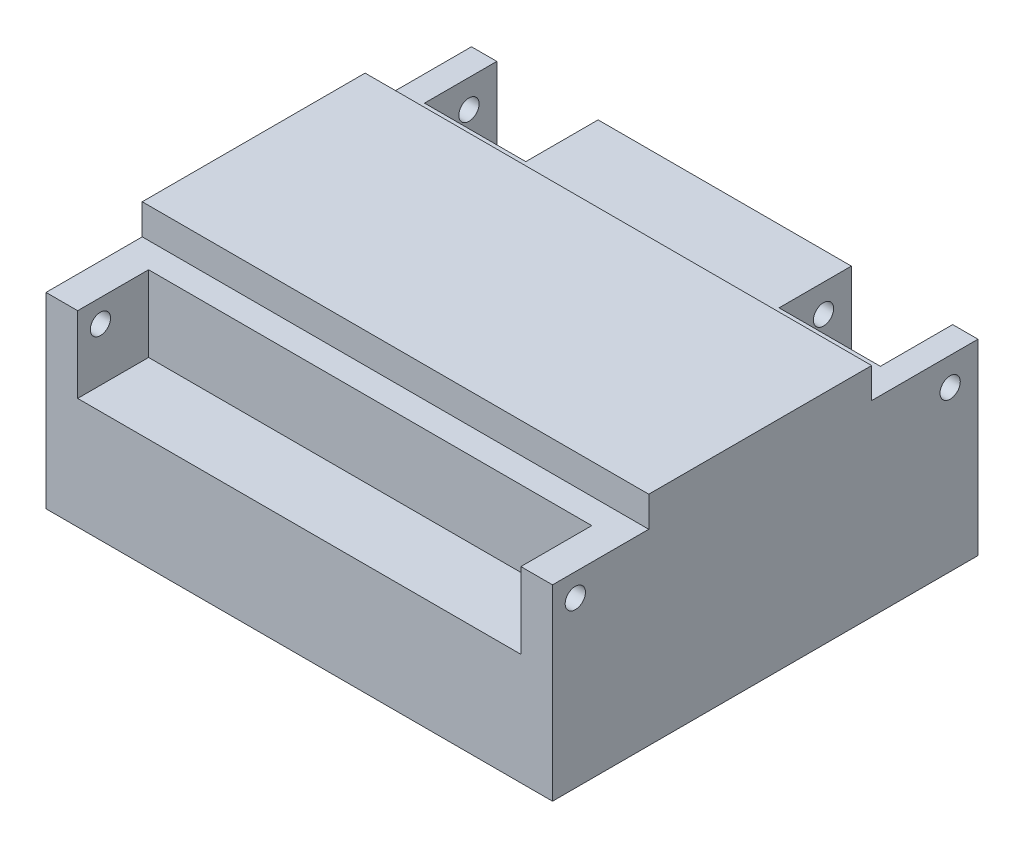
ISO-10303-21;
HEADER;
FILE_DESCRIPTION(('STEP AP214'),'2;1');
FILE_NAME('part.step','',(''),(''),'','','');
FILE_SCHEMA(('AUTOMOTIVE_DESIGN { 1 0 10303 214 1 1 1 1 }'));
ENDSEC;
DATA;
#1=APPLICATION_CONTEXT('core data for automotive mechanical design processes');
#2=APPLICATION_PROTOCOL_DEFINITION('international standard','automotive_design',2000,#1);
#3=PRODUCT_CONTEXT('',#1,'mechanical');
#4=PRODUCT('Part','Part','',(#3));
#5=PRODUCT_RELATED_PRODUCT_CATEGORY('part','',(#4));
#6=PRODUCT_DEFINITION_FORMATION('','',#4);
#7=PRODUCT_DEFINITION_CONTEXT('part definition',#1,'design');
#8=PRODUCT_DEFINITION('design','',#6,#7);
#9=PRODUCT_DEFINITION_SHAPE('','',#8);
#10=(LENGTH_UNIT() NAMED_UNIT(*) SI_UNIT(.MILLI.,.METRE.));
#11=(NAMED_UNIT(*) PLANE_ANGLE_UNIT() SI_UNIT($,.RADIAN.));
#12=(NAMED_UNIT(*) SI_UNIT($,.STERADIAN.) SOLID_ANGLE_UNIT());
#13=UNCERTAINTY_MEASURE_WITH_UNIT(LENGTH_MEASURE(1.E-05),#10,'distance_accuracy_value','');
#14=(GEOMETRIC_REPRESENTATION_CONTEXT(3) GLOBAL_UNCERTAINTY_ASSIGNED_CONTEXT((#13)) GLOBAL_UNIT_ASSIGNED_CONTEXT((#10,
#11,#12)) REPRESENTATION_CONTEXT('',''));
#15=CARTESIAN_POINT('',(0.,0.,0.));
#16=DIRECTION('',(0.,0.,1.));
#17=DIRECTION('',(1.,0.,0.));
#18=AXIS2_PLACEMENT_3D('',#15,#16,#17);
#19=CARTESIAN_POINT('',(-50.00005,0.5,-36.5));
#20=DIRECTION('',(1.,0.,0.));
#21=DIRECTION('',(0.,0.,-1.));
#22=AXIS2_PLACEMENT_3D('',#19,#20,#21);
#23=CYLINDRICAL_SURFACE('',#22,2.);
#24=CARTESIAN_POINT('',(45.,0.5,-36.5));
#25=DIRECTION('',(1.,0.,0.));
#26=DIRECTION('',(0.,0.,-1.));
#27=AXIS2_PLACEMENT_3D('',#24,#25,#26);
#28=CIRCLE('',#27,2.);
#29=CARTESIAN_POINT('',(45.,0.5,-38.5));
#30=VERTEX_POINT('',#29);
#31=EDGE_CURVE('E37',#30,#30,#28,.F.);
#32=ORIENTED_EDGE('',*,*,#31,.T.);
#33=EDGE_LOOP('',(#32));
#34=FACE_BOUND('',#33,.T.);
#35=CARTESIAN_POINT('',(50.,0.5,-36.5));
#36=DIRECTION('',(1.,0.,0.));
#37=DIRECTION('',(0.,0.,-1.));
#38=AXIS2_PLACEMENT_3D('',#35,#36,#37);
#39=CIRCLE('',#38,2.);
#40=CARTESIAN_POINT('',(50.,0.5,-38.5));
#41=VERTEX_POINT('',#40);
#42=EDGE_CURVE('E266',#41,#41,#39,.T.);
#43=ORIENTED_EDGE('',*,*,#42,.T.);
#44=EDGE_LOOP('',(#43));
#45=FACE_BOUND('',#44,.T.);
#46=ADVANCED_FACE('F33',(#34,#45),#23,.F.);
#47=CARTESIAN_POINT('',(-45.,0.5,-36.5));
#48=DIRECTION('',(-1.,0.,0.));
#49=DIRECTION('',(0.,0.,1.));
#50=AXIS2_PLACEMENT_3D('',#47,#48,#49);
#51=CIRCLE('',#50,2.);
#52=CARTESIAN_POINT('',(-45.,0.5,-34.5));
#53=VERTEX_POINT('',#52);
#54=EDGE_CURVE('E270',#53,#53,#51,.F.);
#55=ORIENTED_EDGE('',*,*,#54,.T.);
#56=EDGE_LOOP('',(#55));
#57=FACE_BOUND('',#56,.T.);
#58=CARTESIAN_POINT('',(-50.,0.5,-36.5));
#59=DIRECTION('',(1.,0.,0.));
#60=DIRECTION('',(0.,0.,-1.));
#61=AXIS2_PLACEMENT_3D('',#58,#59,#60);
#62=CIRCLE('',#61,2.);
#63=CARTESIAN_POINT('',(-50.,0.5,-38.5));
#64=VERTEX_POINT('',#63);
#65=EDGE_CURVE('E279',#64,#64,#62,.T.);
#66=ORIENTED_EDGE('',*,*,#65,.F.);
#67=EDGE_LOOP('',(#66));
#68=FACE_BOUND('',#67,.T.);
#69=ADVANCED_FACE('F515',(#57,#68),#23,.F.);
#70=CARTESIAN_POINT('',(15.,0.,-12.));
#71=DIRECTION('',(0.,1.,0.));
#72=DIRECTION('',(0.,0.,1.));
#73=AXIS2_PLACEMENT_3D('',#70,#71,#72);
#74=PLANE('',#73);
#75=DIRECTION('',(0.,0.,-1.));
#76=VECTOR('',#75,1.);
#77=CARTESIAN_POINT('',(-15.,0.,-12.));
#78=LINE('',#77,#76);
#79=CARTESIAN_POINT('',(-15.,0.,-12.));
#80=VERTEX_POINT('',#79);
#81=CARTESIAN_POINT('',(-15.,0.,-34.5635083268963));
#82=VERTEX_POINT('',#81);
#83=EDGE_CURVE('E344',#80,#82,#78,.T.);
#84=ORIENTED_EDGE('',*,*,#83,.T.);
#85=DIRECTION('',(1.,0.,0.));
#86=VECTOR('',#85,1.);
#87=CARTESIAN_POINT('',(-50.00005,0.,-34.5635083268963));
#88=LINE('',#87,#86);
#89=CARTESIAN_POINT('',(15.,0.,-34.5635083268963));
#90=VERTEX_POINT('',#89);
#91=EDGE_CURVE('E273',#82,#90,#88,.T.);
#92=ORIENTED_EDGE('',*,*,#91,.T.);
#93=DIRECTION('',(0.,0.,-1.));
#94=VECTOR('',#93,1.);
#95=CARTESIAN_POINT('',(15.,0.,-12.));
#96=LINE('',#95,#94);
#97=CARTESIAN_POINT('',(15.,0.,-12.));
#98=VERTEX_POINT('',#97);
#99=EDGE_CURVE('E339',#98,#90,#96,.T.);
#100=ORIENTED_EDGE('',*,*,#99,.F.);
#101=DIRECTION('',(1.,0.,0.));
#102=VECTOR('',#101,1.);
#103=CARTESIAN_POINT('',(15.,0.,-12.));
#104=LINE('',#103,#102);
#105=EDGE_CURVE('E326',#80,#98,#104,.T.);
#106=ORIENTED_EDGE('',*,*,#105,.F.);
#107=EDGE_LOOP('',(#84,#92,#100,#106));
#108=FACE_BOUND('',#107,.T.);
#109=ADVANCED_FACE('F523',(#108),#74,.F.);
#110=CARTESIAN_POINT('',(50.00005,1.5,37.5));
#111=DIRECTION('',(-1.,0.,0.));
#112=DIRECTION('',(0.,0.,1.));
#113=AXIS2_PLACEMENT_3D('',#110,#111,#112);
#114=CYLINDRICAL_SURFACE('',#113,2.);
#115=CARTESIAN_POINT('',(43.75,1.5,37.5));
#116=DIRECTION('',(1.,0.,0.));
#117=DIRECTION('',(0.,0.,-1.));
#118=AXIS2_PLACEMENT_3D('',#115,#116,#117);
#119=CIRCLE('',#118,2.);
#120=CARTESIAN_POINT('',(43.75,1.5,35.5));
#121=VERTEX_POINT('',#120);
#122=EDGE_CURVE('E305',#121,#121,#119,.F.);
#123=ORIENTED_EDGE('',*,*,#122,.T.);
#124=EDGE_LOOP('',(#123));
#125=FACE_BOUND('',#124,.T.);
#126=CARTESIAN_POINT('',(50.,1.5,37.5));
#127=DIRECTION('',(-1.,0.,0.));
#128=DIRECTION('',(0.,0.,1.));
#129=AXIS2_PLACEMENT_3D('',#126,#127,#128);
#130=CIRCLE('',#129,2.);
#131=CARTESIAN_POINT('',(50.,1.5,39.5));
#132=VERTEX_POINT('',#131);
#133=EDGE_CURVE('E312',#132,#132,#130,.T.);
#134=ORIENTED_EDGE('',*,*,#133,.F.);
#135=EDGE_LOOP('',(#134));
#136=FACE_BOUND('',#135,.T.);
#137=ADVANCED_FACE('F619',(#125,#136),#114,.F.);
#138=CARTESIAN_POINT('',(0.,6.,0.));
#139=DIRECTION('',(0.,1.,0.));
#140=DIRECTION('',(0.,0.,1.));
#141=AXIS2_PLACEMENT_3D('',#138,#139,#140);
#142=PLANE('',#141);
#143=DIRECTION('',(0.,0.,-1.));
#144=VECTOR('',#143,1.);
#145=CARTESIAN_POINT('',(43.75,6.,54.));
#146=LINE('',#145,#144);
#147=CARTESIAN_POINT('',(43.75,6.,42.));
#148=VERTEX_POINT('',#147);
#149=CARTESIAN_POINT('',(43.75,6.,28.));
#150=VERTEX_POINT('',#149);
#151=EDGE_CURVE('E282',#148,#150,#146,.T.);
#152=ORIENTED_EDGE('',*,*,#151,.F.);
#153=DIRECTION('',(1.,0.,0.));
#154=VECTOR('',#153,1.);
#155=CARTESIAN_POINT('',(-50.,6.,42.));
#156=LINE('',#155,#154);
#157=CARTESIAN_POINT('',(50.,6.,42.));
#158=VERTEX_POINT('',#157);
#159=EDGE_CURVE('E459',#148,#158,#156,.T.);
#160=ORIENTED_EDGE('',*,*,#159,.T.);
#161=DIRECTION('',(0.,0.,-1.));
#162=VECTOR('',#161,1.);
#163=CARTESIAN_POINT('',(50.,6.,-42.));
#164=LINE('',#163,#162);
#165=CARTESIAN_POINT('',(50.,6.,22.9999999999999));
#166=VERTEX_POINT('',#165);
#167=EDGE_CURVE('E448',#158,#166,#164,.T.);
#168=ORIENTED_EDGE('',*,*,#167,.T.);
#169=DIRECTION('',(1.,0.,0.));
#170=VECTOR('',#169,1.);
#171=CARTESIAN_POINT('',(-50.,6.,23.));
#172=LINE('',#171,#170);
#173=CARTESIAN_POINT('',(-50.,6.,22.9999999999999));
#174=VERTEX_POINT('',#173);
#175=EDGE_CURVE('E368',#174,#166,#172,.T.);
#176=ORIENTED_EDGE('',*,*,#175,.F.);
#177=DIRECTION('',(0.,0.,1.));
#178=VECTOR('',#177,1.);
#179=CARTESIAN_POINT('',(-50.,6.,-42.));
#180=LINE('',#179,#178);
#181=CARTESIAN_POINT('',(-50.,6.,42.));
#182=VERTEX_POINT('',#181);
#183=EDGE_CURVE('E383',#174,#182,#180,.T.);
#184=ORIENTED_EDGE('',*,*,#183,.T.);
#185=CARTESIAN_POINT('',(-43.75,6.,42.));
#186=VERTEX_POINT('',#185);
#187=EDGE_CURVE('E462',#182,#186,#156,.T.);
#188=ORIENTED_EDGE('',*,*,#187,.T.);
#189=DIRECTION('',(0.,0.,1.));
#190=VECTOR('',#189,1.);
#191=CARTESIAN_POINT('',(-43.75,6.,54.));
#192=LINE('',#191,#190);
#193=CARTESIAN_POINT('',(-43.75,6.,28.));
#194=VERTEX_POINT('',#193);
#195=EDGE_CURVE('E286',#194,#186,#192,.T.);
#196=ORIENTED_EDGE('',*,*,#195,.F.);
#197=DIRECTION('',(-1.,0.,0.));
#198=VECTOR('',#197,1.);
#199=CARTESIAN_POINT('',(-43.75,6.,28.));
#200=LINE('',#199,#198);
#201=EDGE_CURVE('E293',#150,#194,#200,.T.);
#202=ORIENTED_EDGE('',*,*,#201,.F.);
#203=EDGE_LOOP('',(#152,#160,#168,#176,#184,#188,#196,#202));
#204=FACE_BOUND('',#203,.T.);
#205=ADVANCED_FACE('F491',(#204),#142,.T.);
#206=CARTESIAN_POINT('',(50.,6.,-42.));
#207=DIRECTION('',(-1.,0.,0.));
#208=DIRECTION('',(0.,0.,1.));
#209=AXIS2_PLACEMENT_3D('',#206,#207,#208);
#210=PLANE('',#209);
#211=ORIENTED_EDGE('',*,*,#42,.F.);
#212=EDGE_LOOP('',(#211));
#213=FACE_BOUND('',#212,.T.);
#214=ORIENTED_EDGE('',*,*,#133,.T.);
#215=EDGE_LOOP('',(#214));
#216=FACE_BOUND('',#215,.T.);
#217=DIRECTION('',(0.,-1.,0.));
#218=VECTOR('',#217,1.);
#219=CARTESIAN_POINT('',(50.,6.,42.));
#220=LINE('',#219,#218);
#221=CARTESIAN_POINT('',(50.,-31.,42.));
#222=VERTEX_POINT('',#221);
#223=EDGE_CURVE('E466',#158,#222,#220,.T.);
#224=ORIENTED_EDGE('',*,*,#223,.T.);
#225=DIRECTION('',(0.,0.,1.));
#226=VECTOR('',#225,1.);
#227=CARTESIAN_POINT('',(50.,-31.,42.));
#228=LINE('',#227,#226);
#229=CARTESIAN_POINT('',(50.,-31.,-42.));
#230=VERTEX_POINT('',#229);
#231=EDGE_CURVE('E357',#230,#222,#228,.T.);
#232=ORIENTED_EDGE('',*,*,#231,.F.);
#233=DIRECTION('',(0.,-1.,0.));
#234=VECTOR('',#233,1.);
#235=CARTESIAN_POINT('',(50.,6.,-42.));
#236=LINE('',#235,#234);
#237=CARTESIAN_POINT('',(50.,6.,-42.));
#238=VERTEX_POINT('',#237);
#239=EDGE_CURVE('E413',#238,#230,#236,.T.);
#240=ORIENTED_EDGE('',*,*,#239,.F.);
#241=CARTESIAN_POINT('',(50.,6.,-21.));
#242=VERTEX_POINT('',#241);
#243=EDGE_CURVE('E395',#242,#238,#164,.T.);
#244=ORIENTED_EDGE('',*,*,#243,.F.);
#245=DIRECTION('',(0.,-1.,0.));
#246=VECTOR('',#245,1.);
#247=CARTESIAN_POINT('',(50.,12.,-21.));
#248=LINE('',#247,#246);
#249=CARTESIAN_POINT('',(50.,12.,-21.));
#250=VERTEX_POINT('',#249);
#251=EDGE_CURVE('E389',#250,#242,#248,.T.);
#252=ORIENTED_EDGE('',*,*,#251,.F.);
#253=DIRECTION('',(0.,0.,-1.));
#254=VECTOR('',#253,1.);
#255=CARTESIAN_POINT('',(50.,12.,-21.));
#256=LINE('',#255,#254);
#257=CARTESIAN_POINT('',(50.,12.,23.));
#258=VERTEX_POINT('',#257);
#259=EDGE_CURVE('E364',#258,#250,#256,.T.);
#260=ORIENTED_EDGE('',*,*,#259,.F.);
#261=DIRECTION('',(0.,-1.,0.));
#262=VECTOR('',#261,1.);
#263=CARTESIAN_POINT('',(50.,12.,23.));
#264=LINE('',#263,#262);
#265=EDGE_CURVE('E374',#258,#166,#264,.T.);
#266=ORIENTED_EDGE('',*,*,#265,.T.);
#267=ORIENTED_EDGE('',*,*,#167,.F.);
#268=EDGE_LOOP('',(#224,#232,#240,#244,#252,#260,#266,#267));
#269=FACE_BOUND('',#268,.T.);
#270=ADVANCED_FACE('F35',(#213,#216,#269),#210,.F.);
#271=CARTESIAN_POINT('',(-50.,6.,-42.));
#272=DIRECTION('',(0.,0.,1.));
#273=DIRECTION('',(1.,0.,0.));
#274=AXIS2_PLACEMENT_3D('',#271,#272,#273);
#275=PLANE('',#274);
#276=DIRECTION('',(-1.,0.,0.));
#277=VECTOR('',#276,1.);
#278=CARTESIAN_POINT('',(45.,-9.,-42.));
#279=LINE('',#278,#277);
#280=CARTESIAN_POINT('',(45.,-9.,-42.));
#281=VERTEX_POINT('',#280);
#282=CARTESIAN_POINT('',(25.,-9.,-42.));
#283=VERTEX_POINT('',#282);
#284=EDGE_CURVE('E216',#281,#283,#279,.T.);
#285=ORIENTED_EDGE('',*,*,#284,.F.);
#286=DIRECTION('',(0.,1.,0.));
#287=VECTOR('',#286,1.);
#288=CARTESIAN_POINT('',(45.,-9.,-42.));
#289=LINE('',#288,#287);
#290=CARTESIAN_POINT('',(45.,6.,-42.));
#291=VERTEX_POINT('',#290);
#292=EDGE_CURVE('E420',#281,#291,#289,.T.);
#293=ORIENTED_EDGE('',*,*,#292,.T.);
#294=DIRECTION('',(-1.,0.,0.));
#295=VECTOR('',#294,1.);
#296=CARTESIAN_POINT('',(-50.,6.,-42.));
#297=LINE('',#296,#295);
#298=EDGE_CURVE('E442',#238,#291,#297,.T.);
#299=ORIENTED_EDGE('',*,*,#298,.F.);
#300=ORIENTED_EDGE('',*,*,#239,.T.);
#301=DIRECTION('',(1.,0.,0.));
#302=VECTOR('',#301,1.);
#303=CARTESIAN_POINT('',(-50.,-31.,-42.));
#304=LINE('',#303,#302);
#305=CARTESIAN_POINT('',(-50.,-31.,-42.));
#306=VERTEX_POINT('',#305);
#307=EDGE_CURVE('E354',#306,#230,#304,.T.);
#308=ORIENTED_EDGE('',*,*,#307,.F.);
#309=DIRECTION('',(0.,-1.,0.));
#310=VECTOR('',#309,1.);
#311=CARTESIAN_POINT('',(-50.,6.,-42.));
#312=LINE('',#311,#310);
#313=CARTESIAN_POINT('',(-50.,6.,-42.));
#314=VERTEX_POINT('',#313);
#315=EDGE_CURVE('E469',#314,#306,#312,.T.);
#316=ORIENTED_EDGE('',*,*,#315,.F.);
#317=CARTESIAN_POINT('',(-45.,6.,-42.));
#318=VERTEX_POINT('',#317);
#319=EDGE_CURVE('E446',#318,#314,#297,.T.);
#320=ORIENTED_EDGE('',*,*,#319,.F.);
#321=DIRECTION('',(0.,1.,0.));
#322=VECTOR('',#321,1.);
#323=CARTESIAN_POINT('',(-45.,-9.,-42.));
#324=LINE('',#323,#322);
#325=CARTESIAN_POINT('',(-45.,-9.,-42.));
#326=VERTEX_POINT('',#325);
#327=EDGE_CURVE('E258',#326,#318,#324,.T.);
#328=ORIENTED_EDGE('',*,*,#327,.F.);
#329=DIRECTION('',(-1.,0.,0.));
#330=VECTOR('',#329,1.);
#331=CARTESIAN_POINT('',(-45.,-9.,-42.));
#332=LINE('',#331,#330);
#333=CARTESIAN_POINT('',(-25.,-9.,-42.));
#334=VERTEX_POINT('',#333);
#335=EDGE_CURVE('E248',#334,#326,#332,.T.);
#336=ORIENTED_EDGE('',*,*,#335,.F.);
#337=DIRECTION('',(0.,1.,0.));
#338=VECTOR('',#337,1.);
#339=CARTESIAN_POINT('',(-25.,-9.,-42.));
#340=LINE('',#339,#338);
#341=CARTESIAN_POINT('',(-25.,6.,-42.));
#342=VERTEX_POINT('',#341);
#343=EDGE_CURVE('E261',#334,#342,#340,.T.);
#344=ORIENTED_EDGE('',*,*,#343,.T.);
#345=CARTESIAN_POINT('',(25.,6.,-42.));
#346=VERTEX_POINT('',#345);
#347=EDGE_CURVE('E231',#346,#342,#297,.T.);
#348=ORIENTED_EDGE('',*,*,#347,.F.);
#349=DIRECTION('',(0.,1.,0.));
#350=VECTOR('',#349,1.);
#351=CARTESIAN_POINT('',(25.,-9.,-42.));
#352=LINE('',#351,#350);
#353=EDGE_CURVE('E50',#283,#346,#352,.T.);
#354=ORIENTED_EDGE('',*,*,#353,.F.);
#355=EDGE_LOOP('',(#285,#293,#299,#300,#308,#316,#320,#328,#336,#344,#348,#354));
#356=FACE_BOUND('',#355,.T.);
#357=DIRECTION('',(-1.,0.,0.));
#358=VECTOR('',#357,1.);
#359=CARTESIAN_POINT('',(15.,-5.69935721066687,-42.));
#360=LINE('',#359,#358);
#361=CARTESIAN_POINT('',(15.,-5.69935721066687,-42.));
#362=VERTEX_POINT('',#361);
#363=CARTESIAN_POINT('',(-15.,-5.69935721066687,-42.));
#364=VERTEX_POINT('',#363);
#365=EDGE_CURVE('E331',#362,#364,#360,.T.);
#366=ORIENTED_EDGE('',*,*,#365,.F.);
#367=DIRECTION('',(0.,-1.,0.));
#368=VECTOR('',#367,1.);
#369=CARTESIAN_POINT('',(15.,0.,-42.));
#370=LINE('',#369,#368);
#371=CARTESIAN_POINT('',(15.,0.,-42.));
#372=VERTEX_POINT('',#371);
#373=EDGE_CURVE('E315',#372,#362,#370,.T.);
#374=ORIENTED_EDGE('',*,*,#373,.F.);
#375=DIRECTION('',(1.,0.,0.));
#376=VECTOR('',#375,1.);
#377=CARTESIAN_POINT('',(15.,0.,-42.));
#378=LINE('',#377,#376);
#379=CARTESIAN_POINT('',(-15.,0.,-42.));
#380=VERTEX_POINT('',#379);
#381=EDGE_CURVE('E320',#380,#372,#378,.T.);
#382=ORIENTED_EDGE('',*,*,#381,.F.);
#383=DIRECTION('',(0.,1.,0.));
#384=VECTOR('',#383,1.);
#385=CARTESIAN_POINT('',(-15.,0.,-42.));
#386=LINE('',#385,#384);
#387=EDGE_CURVE('E334',#364,#380,#386,.T.);
#388=ORIENTED_EDGE('',*,*,#387,.F.);
#389=EDGE_LOOP('',(#366,#374,#382,#388));
#390=FACE_BOUND('',#389,.T.);
#391=ADVANCED_FACE('F228',(#356,#390),#275,.F.);
#392=CARTESIAN_POINT('',(-50.,6.,-42.));
#393=DIRECTION('',(1.,0.,0.));
#394=DIRECTION('',(0.,0.,-1.));
#395=AXIS2_PLACEMENT_3D('',#392,#393,#394);
#396=PLANE('',#395);
#397=ORIENTED_EDGE('',*,*,#65,.T.);
#398=EDGE_LOOP('',(#397));
#399=FACE_BOUND('',#398,.T.);
#400=CARTESIAN_POINT('',(-50.,1.5,37.5));
#401=DIRECTION('',(-1.,0.,0.));
#402=DIRECTION('',(0.,0.,1.));
#403=AXIS2_PLACEMENT_3D('',#400,#401,#402);
#404=CIRCLE('',#403,2.);
#405=CARTESIAN_POINT('',(-50.,1.5,39.5));
#406=VERTEX_POINT('',#405);
#407=EDGE_CURVE('E309',#406,#406,#404,.T.);
#408=ORIENTED_EDGE('',*,*,#407,.F.);
#409=EDGE_LOOP('',(#408));
#410=FACE_BOUND('',#409,.T.);
#411=ORIENTED_EDGE('',*,*,#315,.T.);
#412=DIRECTION('',(0.,0.,-1.));
#413=VECTOR('',#412,1.);
#414=CARTESIAN_POINT('',(-50.,-31.,42.));
#415=LINE('',#414,#413);
#416=CARTESIAN_POINT('',(-50.,-31.,42.));
#417=VERTEX_POINT('',#416);
#418=EDGE_CURVE('E342',#417,#306,#415,.T.);
#419=ORIENTED_EDGE('',*,*,#418,.F.);
#420=DIRECTION('',(0.,-1.,0.));
#421=VECTOR('',#420,1.);
#422=CARTESIAN_POINT('',(-50.,6.,42.));
#423=LINE('',#422,#421);
#424=EDGE_CURVE('E468',#182,#417,#423,.T.);
#425=ORIENTED_EDGE('',*,*,#424,.F.);
#426=ORIENTED_EDGE('',*,*,#183,.F.);
#427=DIRECTION('',(0.,-1.,0.));
#428=VECTOR('',#427,1.);
#429=CARTESIAN_POINT('',(-50.,12.,23.));
#430=LINE('',#429,#428);
#431=CARTESIAN_POINT('',(-50.,12.,23.));
#432=VERTEX_POINT('',#431);
#433=EDGE_CURVE('E390',#432,#174,#430,.T.);
#434=ORIENTED_EDGE('',*,*,#433,.F.);
#435=DIRECTION('',(0.,0.,1.));
#436=VECTOR('',#435,1.);
#437=CARTESIAN_POINT('',(-50.,12.,-21.));
#438=LINE('',#437,#436);
#439=CARTESIAN_POINT('',(-50.,12.,-21.));
#440=VERTEX_POINT('',#439);
#441=EDGE_CURVE('E370',#440,#432,#438,.T.);
#442=ORIENTED_EDGE('',*,*,#441,.F.);
#443=DIRECTION('',(0.,-1.,0.));
#444=VECTOR('',#443,1.);
#445=CARTESIAN_POINT('',(-50.,12.,-21.));
#446=LINE('',#445,#444);
#447=CARTESIAN_POINT('',(-50.,6.,-21.));
#448=VERTEX_POINT('',#447);
#449=EDGE_CURVE('E386',#440,#448,#446,.T.);
#450=ORIENTED_EDGE('',*,*,#449,.T.);
#451=EDGE_CURVE('E447',#314,#448,#180,.T.);
#452=ORIENTED_EDGE('',*,*,#451,.F.);
#453=EDGE_LOOP('',(#411,#419,#425,#426,#434,#442,#450,#452));
#454=FACE_BOUND('',#453,.T.);
#455=ADVANCED_FACE('F485',(#399,#410,#454),#396,.F.);
#456=CARTESIAN_POINT('',(-50.,6.,42.));
#457=DIRECTION('',(0.,0.,-1.));
#458=DIRECTION('',(-1.,0.,0.));
#459=AXIS2_PLACEMENT_3D('',#456,#457,#458);
#460=PLANE('',#459);
#461=ORIENTED_EDGE('',*,*,#159,.F.);
#462=DIRECTION('',(0.,-1.,0.));
#463=VECTOR('',#462,1.);
#464=CARTESIAN_POINT('',(43.75,6.,42.));
#465=LINE('',#464,#463);
#466=CARTESIAN_POINT('',(43.75,-9.,42.));
#467=VERTEX_POINT('',#466);
#468=EDGE_CURVE('E306',#148,#467,#465,.T.);
#469=ORIENTED_EDGE('',*,*,#468,.T.);
#470=DIRECTION('',(-1.,0.,0.));
#471=VECTOR('',#470,1.);
#472=CARTESIAN_POINT('',(-50.,-9.,42.));
#473=LINE('',#472,#471);
#474=CARTESIAN_POINT('',(-43.75,-9.,42.));
#475=VERTEX_POINT('',#474);
#476=EDGE_CURVE('E42',#467,#475,#473,.T.);
#477=ORIENTED_EDGE('',*,*,#476,.T.);
#478=DIRECTION('',(0.,1.,0.));
#479=VECTOR('',#478,1.);
#480=CARTESIAN_POINT('',(-43.75,6.,42.));
#481=LINE('',#480,#479);
#482=EDGE_CURVE('E302',#475,#186,#481,.T.);
#483=ORIENTED_EDGE('',*,*,#482,.T.);
#484=ORIENTED_EDGE('',*,*,#187,.F.);
#485=ORIENTED_EDGE('',*,*,#424,.T.);
#486=DIRECTION('',(-1.,0.,0.));
#487=VECTOR('',#486,1.);
#488=CARTESIAN_POINT('',(-50.,-31.,42.));
#489=LINE('',#488,#487);
#490=EDGE_CURVE('E360',#222,#417,#489,.T.);
#491=ORIENTED_EDGE('',*,*,#490,.F.);
#492=ORIENTED_EDGE('',*,*,#223,.F.);
#493=EDGE_LOOP('',(#461,#469,#477,#483,#484,#485,#491,#492));
#494=FACE_BOUND('',#493,.T.);
#495=ADVANCED_FACE('F482',(#494),#460,.F.);
#496=DIRECTION('',(0.,0.,-1.));
#497=VECTOR('',#496,1.);
#498=CARTESIAN_POINT('',(45.,6.,-42.));
#499=LINE('',#498,#497);
#500=CARTESIAN_POINT('',(45.,6.,-27.7230108647227));
#501=VERTEX_POINT('',#500);
#502=EDGE_CURVE('E225',#501,#291,#499,.T.);
#503=ORIENTED_EDGE('',*,*,#502,.F.);
#504=DIRECTION('',(1.,0.,0.));
#505=VECTOR('',#504,1.);
#506=CARTESIAN_POINT('',(45.,6.,-27.7230108647227));
#507=LINE('',#506,#505);
#508=CARTESIAN_POINT('',(25.,6.,-27.7230108647227));
#509=VERTEX_POINT('',#508);
#510=EDGE_CURVE('E429',#509,#501,#507,.T.);
#511=ORIENTED_EDGE('',*,*,#510,.F.);
#512=DIRECTION('',(0.,0.,1.));
#513=VECTOR('',#512,1.);
#514=CARTESIAN_POINT('',(25.,6.,-42.));
#515=LINE('',#514,#513);
#516=EDGE_CURVE('E432',#346,#509,#515,.T.);
#517=ORIENTED_EDGE('',*,*,#516,.F.);
#518=ORIENTED_EDGE('',*,*,#347,.T.);
#519=DIRECTION('',(0.,0.,-1.));
#520=VECTOR('',#519,1.);
#521=CARTESIAN_POINT('',(-25.,6.,-42.));
#522=LINE('',#521,#520);
#523=CARTESIAN_POINT('',(-25.,6.,-27.7230108647227));
#524=VERTEX_POINT('',#523);
#525=EDGE_CURVE('E242',#524,#342,#522,.T.);
#526=ORIENTED_EDGE('',*,*,#525,.F.);
#527=DIRECTION('',(1.,0.,0.));
#528=VECTOR('',#527,1.);
#529=CARTESIAN_POINT('',(-45.,6.,-27.7230108647227));
#530=LINE('',#529,#528);
#531=CARTESIAN_POINT('',(-45.,6.,-27.7230108647227));
#532=VERTEX_POINT('',#531);
#533=EDGE_CURVE('E253',#532,#524,#530,.T.);
#534=ORIENTED_EDGE('',*,*,#533,.F.);
#535=DIRECTION('',(0.,0.,1.));
#536=VECTOR('',#535,1.);
#537=CARTESIAN_POINT('',(-45.,6.,-42.));
#538=LINE('',#537,#536);
#539=EDGE_CURVE('E58',#318,#532,#538,.T.);
#540=ORIENTED_EDGE('',*,*,#539,.F.);
#541=ORIENTED_EDGE('',*,*,#319,.T.);
#542=ORIENTED_EDGE('',*,*,#451,.T.);
#543=DIRECTION('',(-1.,0.,0.));
#544=VECTOR('',#543,1.);
#545=CARTESIAN_POINT('',(-50.,6.,-21.));
#546=LINE('',#545,#544);
#547=EDGE_CURVE('E363',#242,#448,#546,.T.);
#548=ORIENTED_EDGE('',*,*,#547,.F.);
#549=ORIENTED_EDGE('',*,*,#243,.T.);
#550=ORIENTED_EDGE('',*,*,#298,.T.);
#551=EDGE_LOOP('',(#503,#511,#517,#518,#526,#534,#540,#541,#542,#548,#549,#550));
#552=FACE_BOUND('',#551,.T.);
#553=ADVANCED_FACE('F441',(#552),#142,.T.);
#554=CARTESIAN_POINT('',(-50.,12.,-21.));
#555=DIRECTION('',(0.,0.,1.));
#556=DIRECTION('',(1.,0.,0.));
#557=AXIS2_PLACEMENT_3D('',#554,#555,#556);
#558=PLANE('',#557);
#559=ORIENTED_EDGE('',*,*,#547,.T.);
#560=ORIENTED_EDGE('',*,*,#449,.F.);
#561=DIRECTION('',(-1.,0.,0.));
#562=VECTOR('',#561,1.);
#563=CARTESIAN_POINT('',(-50.,12.,-21.));
#564=LINE('',#563,#562);
#565=EDGE_CURVE('E367',#250,#440,#564,.T.);
#566=ORIENTED_EDGE('',*,*,#565,.F.);
#567=ORIENTED_EDGE('',*,*,#251,.T.);
#568=EDGE_LOOP('',(#559,#560,#566,#567));
#569=FACE_BOUND('',#568,.T.);
#570=ADVANCED_FACE('F504',(#569),#558,.F.);
#571=CARTESIAN_POINT('',(-50.,12.,23.));
#572=DIRECTION('',(0.,0.,-1.));
#573=DIRECTION('',(-1.,0.,0.));
#574=AXIS2_PLACEMENT_3D('',#571,#572,#573);
#575=PLANE('',#574);
#576=ORIENTED_EDGE('',*,*,#175,.T.);
#577=ORIENTED_EDGE('',*,*,#265,.F.);
#578=DIRECTION('',(1.,0.,0.));
#579=VECTOR('',#578,1.);
#580=CARTESIAN_POINT('',(-50.,12.,23.));
#581=LINE('',#580,#579);
#582=EDGE_CURVE('E372',#432,#258,#581,.T.);
#583=ORIENTED_EDGE('',*,*,#582,.F.);
#584=ORIENTED_EDGE('',*,*,#433,.T.);
#585=EDGE_LOOP('',(#576,#577,#583,#584));
#586=FACE_BOUND('',#585,.T.);
#587=ADVANCED_FACE('F495',(#586),#575,.F.);
#588=CARTESIAN_POINT('',(0.,12.,0.));
#589=DIRECTION('',(0.,1.,0.));
#590=DIRECTION('',(0.,0.,1.));
#591=AXIS2_PLACEMENT_3D('',#588,#589,#590);
#592=PLANE('',#591);
#593=ORIENTED_EDGE('',*,*,#259,.T.);
#594=ORIENTED_EDGE('',*,*,#565,.T.);
#595=ORIENTED_EDGE('',*,*,#441,.T.);
#596=ORIENTED_EDGE('',*,*,#582,.T.);
#597=EDGE_LOOP('',(#593,#594,#595,#596));
#598=FACE_BOUND('',#597,.T.);
#599=ADVANCED_FACE('F500',(#598),#592,.T.);
#600=CARTESIAN_POINT('',(0.,-31.,0.));
#601=DIRECTION('',(0.,-1.,0.));
#602=DIRECTION('',(0.,0.,-1.));
#603=AXIS2_PLACEMENT_3D('',#600,#601,#602);
#604=PLANE('',#603);
#605=ORIENTED_EDGE('',*,*,#418,.T.);
#606=ORIENTED_EDGE('',*,*,#307,.T.);
#607=ORIENTED_EDGE('',*,*,#231,.T.);
#608=ORIENTED_EDGE('',*,*,#490,.T.);
#609=EDGE_LOOP('',(#605,#606,#607,#608));
#610=FACE_BOUND('',#609,.T.);
#611=ADVANCED_FACE('F477',(#610),#604,.T.);
#612=CARTESIAN_POINT('',(15.,0.,-12.));
#613=DIRECTION('',(1.,0.,0.));
#614=DIRECTION('',(0.,0.,-1.));
#615=AXIS2_PLACEMENT_3D('',#612,#613,#614);
#616=PLANE('',#615);
#617=ORIENTED_EDGE('',*,*,#99,.T.);
#618=CARTESIAN_POINT('',(15.,0.5,-36.5));
#619=DIRECTION('',(1.,0.,0.));
#620=DIRECTION('',(0.,0.,-1.));
#621=AXIS2_PLACEMENT_3D('',#618,#619,#620);
#622=CIRCLE('',#621,2.);
#623=CARTESIAN_POINT('',(15.,0.,-38.4364916731037));
#624=VERTEX_POINT('',#623);
#625=EDGE_CURVE('E276',#90,#624,#622,.T.);
#626=ORIENTED_EDGE('',*,*,#625,.T.);
#627=EDGE_CURVE('E343',#624,#372,#96,.T.);
#628=ORIENTED_EDGE('',*,*,#627,.T.);
#629=ORIENTED_EDGE('',*,*,#373,.T.);
#630=DIRECTION('',(0.,0.,-1.));
#631=VECTOR('',#630,1.);
#632=CARTESIAN_POINT('',(15.,-5.69935721066687,-12.));
#633=LINE('',#632,#631);
#634=CARTESIAN_POINT('',(15.,-5.69935721066687,-12.));
#635=VERTEX_POINT('',#634);
#636=EDGE_CURVE('E329',#635,#362,#633,.T.);
#637=ORIENTED_EDGE('',*,*,#636,.F.);
#638=DIRECTION('',(0.,-1.,0.));
#639=VECTOR('',#638,1.);
#640=CARTESIAN_POINT('',(15.,0.,-12.));
#641=LINE('',#640,#639);
#642=EDGE_CURVE('E316',#98,#635,#641,.T.);
#643=ORIENTED_EDGE('',*,*,#642,.F.);
#644=EDGE_LOOP('',(#617,#626,#628,#629,#637,#643));
#645=FACE_BOUND('',#644,.T.);
#646=ADVANCED_FACE('F562',(#645),#616,.F.);
#647=ORIENTED_EDGE('',*,*,#627,.F.);
#648=DIRECTION('',(1.,0.,0.));
#649=VECTOR('',#648,1.);
#650=CARTESIAN_POINT('',(-50.00005,0.,-38.4364916731037));
#651=LINE('',#650,#649);
#652=CARTESIAN_POINT('',(-15.,0.,-38.4364916731037));
#653=VERTEX_POINT('',#652);
#654=EDGE_CURVE('E269',#624,#653,#651,.F.);
#655=ORIENTED_EDGE('',*,*,#654,.T.);
#656=EDGE_CURVE('E347',#653,#380,#78,.T.);
#657=ORIENTED_EDGE('',*,*,#656,.T.);
#658=ORIENTED_EDGE('',*,*,#381,.T.);
#659=EDGE_LOOP('',(#647,#655,#657,#658));
#660=FACE_BOUND('',#659,.T.);
#661=ADVANCED_FACE('F560',(#660),#74,.F.);
#662=CARTESIAN_POINT('',(-15.,0.,-12.));
#663=DIRECTION('',(-1.,0.,0.));
#664=DIRECTION('',(0.,0.,1.));
#665=AXIS2_PLACEMENT_3D('',#662,#663,#664);
#666=PLANE('',#665);
#667=ORIENTED_EDGE('',*,*,#656,.F.);
#668=CARTESIAN_POINT('',(-15.,0.5,-36.5));
#669=DIRECTION('',(-1.,0.,0.));
#670=DIRECTION('',(0.,0.,1.));
#671=AXIS2_PLACEMENT_3D('',#668,#669,#670);
#672=CIRCLE('',#671,2.);
#673=EDGE_CURVE('E11',#653,#82,#672,.T.);
#674=ORIENTED_EDGE('',*,*,#673,.T.);
#675=ORIENTED_EDGE('',*,*,#83,.F.);
#676=DIRECTION('',(0.,1.,0.));
#677=VECTOR('',#676,1.);
#678=CARTESIAN_POINT('',(-15.,0.,-12.));
#679=LINE('',#678,#677);
#680=CARTESIAN_POINT('',(-15.,-5.69935721066687,-12.));
#681=VERTEX_POINT('',#680);
#682=EDGE_CURVE('E323',#681,#80,#679,.T.);
#683=ORIENTED_EDGE('',*,*,#682,.F.);
#684=DIRECTION('',(0.,0.,-1.));
#685=VECTOR('',#684,1.);
#686=CARTESIAN_POINT('',(-15.,-5.69935721066687,-12.));
#687=LINE('',#686,#685);
#688=EDGE_CURVE('E348',#681,#364,#687,.T.);
#689=ORIENTED_EDGE('',*,*,#688,.T.);
#690=ORIENTED_EDGE('',*,*,#387,.T.);
#691=EDGE_LOOP('',(#667,#674,#675,#683,#689,#690));
#692=FACE_BOUND('',#691,.T.);
#693=ADVANCED_FACE('F545',(#692),#666,.F.);
#694=CARTESIAN_POINT('',(15.,-5.69935721066687,-12.));
#695=DIRECTION('',(0.,-1.,0.));
#696=DIRECTION('',(0.,0.,-1.));
#697=AXIS2_PLACEMENT_3D('',#694,#695,#696);
#698=PLANE('',#697);
#699=ORIENTED_EDGE('',*,*,#365,.T.);
#700=ORIENTED_EDGE('',*,*,#688,.F.);
#701=DIRECTION('',(-1.,0.,0.));
#702=VECTOR('',#701,1.);
#703=CARTESIAN_POINT('',(15.,-5.69935721066687,-12.));
#704=LINE('',#703,#702);
#705=EDGE_CURVE('E319',#635,#681,#704,.T.);
#706=ORIENTED_EDGE('',*,*,#705,.F.);
#707=ORIENTED_EDGE('',*,*,#636,.T.);
#708=EDGE_LOOP('',(#699,#700,#706,#707));
#709=FACE_BOUND('',#708,.T.);
#710=ADVANCED_FACE('F556',(#709),#698,.F.);
#711=CARTESIAN_POINT('',(0.,0.,-12.));
#712=DIRECTION('',(0.,0.,-1.));
#713=DIRECTION('',(-1.,0.,0.));
#714=AXIS2_PLACEMENT_3D('',#711,#712,#713);
#715=PLANE('',#714);
#716=ORIENTED_EDGE('',*,*,#642,.T.);
#717=ORIENTED_EDGE('',*,*,#705,.T.);
#718=ORIENTED_EDGE('',*,*,#682,.T.);
#719=ORIENTED_EDGE('',*,*,#105,.T.);
#720=EDGE_LOOP('',(#716,#717,#718,#719));
#721=FACE_BOUND('',#720,.T.);
#722=ADVANCED_FACE('F550',(#721),#715,.T.);
#723=CARTESIAN_POINT('',(-43.75,1.5,37.5));
#724=DIRECTION('',(-1.,0.,0.));
#725=DIRECTION('',(0.,0.,1.));
#726=AXIS2_PLACEMENT_3D('',#723,#724,#725);
#727=CIRCLE('',#726,2.);
#728=CARTESIAN_POINT('',(-43.75,1.5,39.5));
#729=VERTEX_POINT('',#728);
#730=EDGE_CURVE('E299',#729,#729,#727,.F.);
#731=ORIENTED_EDGE('',*,*,#730,.T.);
#732=EDGE_LOOP('',(#731));
#733=FACE_BOUND('',#732,.T.);
#734=ORIENTED_EDGE('',*,*,#407,.T.);
#735=EDGE_LOOP('',(#734));
#736=FACE_BOUND('',#735,.T.);
#737=ADVANCED_FACE('F611',(#733,#736),#114,.F.);
#738=CARTESIAN_POINT('',(0.,-9.,0.));
#739=DIRECTION('',(0.,-1.,0.));
#740=DIRECTION('',(0.,0.,-1.));
#741=AXIS2_PLACEMENT_3D('',#738,#739,#740);
#742=PLANE('',#741);
#743=DIRECTION('',(0.,0.,-1.));
#744=VECTOR('',#743,1.);
#745=CARTESIAN_POINT('',(43.75,-9.,54.));
#746=LINE('',#745,#744);
#747=CARTESIAN_POINT('',(43.75,-9.,28.));
#748=VERTEX_POINT('',#747);
#749=EDGE_CURVE('E283',#467,#748,#746,.T.);
#750=ORIENTED_EDGE('',*,*,#749,.T.);
#751=DIRECTION('',(-1.,0.,0.));
#752=VECTOR('',#751,1.);
#753=CARTESIAN_POINT('',(-43.75,-9.,28.));
#754=LINE('',#753,#752);
#755=CARTESIAN_POINT('',(-43.75,-9.,28.));
#756=VERTEX_POINT('',#755);
#757=EDGE_CURVE('E285',#748,#756,#754,.T.);
#758=ORIENTED_EDGE('',*,*,#757,.T.);
#759=DIRECTION('',(0.,0.,1.));
#760=VECTOR('',#759,1.);
#761=CARTESIAN_POINT('',(-43.75,-9.,54.));
#762=LINE('',#761,#760);
#763=EDGE_CURVE('E289',#756,#475,#762,.T.);
#764=ORIENTED_EDGE('',*,*,#763,.T.);
#765=ORIENTED_EDGE('',*,*,#476,.F.);
#766=EDGE_LOOP('',(#750,#758,#764,#765));
#767=FACE_BOUND('',#766,.T.);
#768=ADVANCED_FACE('F728',(#767),#742,.F.);
#769=CARTESIAN_POINT('',(43.75,-9.,54.));
#770=DIRECTION('',(1.,0.,0.));
#771=DIRECTION('',(0.,0.,-1.));
#772=AXIS2_PLACEMENT_3D('',#769,#770,#771);
#773=PLANE('',#772);
#774=ORIENTED_EDGE('',*,*,#122,.F.);
#775=EDGE_LOOP('',(#774));
#776=FACE_BOUND('',#775,.T.);
#777=ORIENTED_EDGE('',*,*,#151,.T.);
#778=DIRECTION('',(0.,1.,0.));
#779=VECTOR('',#778,1.);
#780=CARTESIAN_POINT('',(43.75,-9.,28.));
#781=LINE('',#780,#779);
#782=EDGE_CURVE('E291',#748,#150,#781,.T.);
#783=ORIENTED_EDGE('',*,*,#782,.F.);
#784=ORIENTED_EDGE('',*,*,#749,.F.);
#785=ORIENTED_EDGE('',*,*,#468,.F.);
#786=EDGE_LOOP('',(#777,#783,#784,#785));
#787=FACE_BOUND('',#786,.T.);
#788=ADVANCED_FACE('F735',(#776,#787),#773,.F.);
#789=CARTESIAN_POINT('',(-43.75,-9.,54.));
#790=DIRECTION('',(-1.,0.,0.));
#791=DIRECTION('',(0.,0.,1.));
#792=AXIS2_PLACEMENT_3D('',#789,#790,#791);
#793=PLANE('',#792);
#794=ORIENTED_EDGE('',*,*,#730,.F.);
#795=EDGE_LOOP('',(#794));
#796=FACE_BOUND('',#795,.T.);
#797=ORIENTED_EDGE('',*,*,#763,.F.);
#798=DIRECTION('',(0.,1.,0.));
#799=VECTOR('',#798,1.);
#800=CARTESIAN_POINT('',(-43.75,-9.,28.));
#801=LINE('',#800,#799);
#802=EDGE_CURVE('E297',#756,#194,#801,.T.);
#803=ORIENTED_EDGE('',*,*,#802,.T.);
#804=ORIENTED_EDGE('',*,*,#195,.T.);
#805=ORIENTED_EDGE('',*,*,#482,.F.);
#806=EDGE_LOOP('',(#797,#803,#804,#805));
#807=FACE_BOUND('',#806,.T.);
#808=ADVANCED_FACE('F536',(#796,#807),#793,.F.);
#809=CARTESIAN_POINT('',(-43.75,-9.,28.));
#810=DIRECTION('',(0.,0.,-1.));
#811=DIRECTION('',(-1.,0.,0.));
#812=AXIS2_PLACEMENT_3D('',#809,#810,#811);
#813=PLANE('',#812);
#814=ORIENTED_EDGE('',*,*,#201,.T.);
#815=ORIENTED_EDGE('',*,*,#802,.F.);
#816=ORIENTED_EDGE('',*,*,#757,.F.);
#817=ORIENTED_EDGE('',*,*,#782,.T.);
#818=EDGE_LOOP('',(#814,#815,#816,#817));
#819=FACE_BOUND('',#818,.T.);
#820=ADVANCED_FACE('F530',(#819),#813,.F.);
#821=CARTESIAN_POINT('',(25.,0.5,-36.5));
#822=DIRECTION('',(-1.,0.,0.));
#823=DIRECTION('',(0.,0.,1.));
#824=AXIS2_PLACEMENT_3D('',#821,#822,#823);
#825=CIRCLE('',#824,2.);
#826=CARTESIAN_POINT('',(25.,0.5,-34.5));
#827=VERTEX_POINT('',#826);
#828=EDGE_CURVE('E418',#827,#827,#825,.F.);
#829=ORIENTED_EDGE('',*,*,#828,.T.);
#830=EDGE_LOOP('',(#829));
#831=FACE_BOUND('',#830,.T.);
#832=CARTESIAN_POINT('',(-25.,0.5,-36.5));
#833=DIRECTION('',(1.,0.,0.));
#834=DIRECTION('',(0.,0.,-1.));
#835=AXIS2_PLACEMENT_3D('',#832,#833,#834);
#836=CIRCLE('',#835,2.);
#837=CARTESIAN_POINT('',(-25.,0.5,-38.5));
#838=VERTEX_POINT('',#837);
#839=EDGE_CURVE('E260',#838,#838,#836,.F.);
#840=ORIENTED_EDGE('',*,*,#839,.T.);
#841=EDGE_LOOP('',(#840));
#842=FACE_BOUND('',#841,.T.);
#843=ORIENTED_EDGE('',*,*,#91,.F.);
#844=ORIENTED_EDGE('',*,*,#673,.F.);
#845=ORIENTED_EDGE('',*,*,#654,.F.);
#846=ORIENTED_EDGE('',*,*,#625,.F.);
#847=EDGE_LOOP('',(#843,#844,#845,#846));
#848=FACE_BOUND('',#847,.T.);
#849=ADVANCED_FACE('F518',(#831,#842,#848),#23,.F.);
#850=CARTESIAN_POINT('',(-45.,-9.,-42.));
#851=DIRECTION('',(-1.,0.,0.));
#852=DIRECTION('',(0.,0.,1.));
#853=AXIS2_PLACEMENT_3D('',#850,#851,#852);
#854=PLANE('',#853);
#855=ORIENTED_EDGE('',*,*,#539,.T.);
#856=DIRECTION('',(0.,1.,0.));
#857=VECTOR('',#856,1.);
#858=CARTESIAN_POINT('',(-45.,-9.,-27.7230108647227));
#859=LINE('',#858,#857);
#860=CARTESIAN_POINT('',(-45.,-9.,-27.7230108647227));
#861=VERTEX_POINT('',#860);
#862=EDGE_CURVE('E251',#861,#532,#859,.T.);
#863=ORIENTED_EDGE('',*,*,#862,.F.);
#864=DIRECTION('',(0.,0.,1.));
#865=VECTOR('',#864,1.);
#866=CARTESIAN_POINT('',(-45.,-9.,-42.));
#867=LINE('',#866,#865);
#868=EDGE_CURVE('E238',#326,#861,#867,.T.);
#869=ORIENTED_EDGE('',*,*,#868,.F.);
#870=ORIENTED_EDGE('',*,*,#327,.T.);
#871=EDGE_LOOP('',(#855,#863,#869,#870));
#872=FACE_BOUND('',#871,.T.);
#873=ORIENTED_EDGE('',*,*,#54,.F.);
#874=EDGE_LOOP('',(#873));
#875=FACE_BOUND('',#874,.T.);
#876=ADVANCED_FACE('F529',(#872,#875),#854,.F.);
#877=CARTESIAN_POINT('',(-25.,-9.,-42.));
#878=DIRECTION('',(1.,0.,0.));
#879=DIRECTION('',(0.,0.,-1.));
#880=AXIS2_PLACEMENT_3D('',#877,#878,#879);
#881=PLANE('',#880);
#882=ORIENTED_EDGE('',*,*,#525,.T.);
#883=ORIENTED_EDGE('',*,*,#343,.F.);
#884=DIRECTION('',(0.,0.,-1.));
#885=VECTOR('',#884,1.);
#886=CARTESIAN_POINT('',(-25.,-9.,-42.));
#887=LINE('',#886,#885);
#888=CARTESIAN_POINT('',(-25.,-9.,-27.7230108647227));
#889=VERTEX_POINT('',#888);
#890=EDGE_CURVE('E245',#889,#334,#887,.T.);
#891=ORIENTED_EDGE('',*,*,#890,.F.);
#892=DIRECTION('',(0.,1.,0.));
#893=VECTOR('',#892,1.);
#894=CARTESIAN_POINT('',(-25.,-9.,-27.7230108647227));
#895=LINE('',#894,#893);
#896=EDGE_CURVE('E263',#889,#524,#895,.T.);
#897=ORIENTED_EDGE('',*,*,#896,.T.);
#898=EDGE_LOOP('',(#882,#883,#891,#897));
#899=FACE_BOUND('',#898,.T.);
#900=ORIENTED_EDGE('',*,*,#839,.F.);
#901=EDGE_LOOP('',(#900));
#902=FACE_BOUND('',#901,.T.);
#903=ADVANCED_FACE('F535',(#899,#902),#881,.F.);
#904=CARTESIAN_POINT('',(-45.,-9.,-27.7230108647227));
#905=DIRECTION('',(0.,0.,1.));
#906=DIRECTION('',(1.,0.,0.));
#907=AXIS2_PLACEMENT_3D('',#904,#905,#906);
#908=PLANE('',#907);
#909=ORIENTED_EDGE('',*,*,#533,.T.);
#910=ORIENTED_EDGE('',*,*,#896,.F.);
#911=DIRECTION('',(1.,0.,0.));
#912=VECTOR('',#911,1.);
#913=CARTESIAN_POINT('',(-45.,-9.,-27.7230108647227));
#914=LINE('',#913,#912);
#915=EDGE_CURVE('E241',#861,#889,#914,.T.);
#916=ORIENTED_EDGE('',*,*,#915,.F.);
#917=ORIENTED_EDGE('',*,*,#862,.T.);
#918=EDGE_LOOP('',(#909,#910,#916,#917));
#919=FACE_BOUND('',#918,.T.);
#920=ADVANCED_FACE('F654',(#919),#908,.F.);
#921=CARTESIAN_POINT('',(0.,-9.,0.));
#922=DIRECTION('',(0.,1.,0.));
#923=DIRECTION('',(0.,0.,1.));
#924=AXIS2_PLACEMENT_3D('',#921,#922,#923);
#925=PLANE('',#924);
#926=ORIENTED_EDGE('',*,*,#868,.T.);
#927=ORIENTED_EDGE('',*,*,#915,.T.);
#928=ORIENTED_EDGE('',*,*,#890,.T.);
#929=ORIENTED_EDGE('',*,*,#335,.T.);
#930=EDGE_LOOP('',(#926,#927,#928,#929));
#931=FACE_BOUND('',#930,.T.);
#932=ADVANCED_FACE('F663',(#931),#925,.T.);
#933=CARTESIAN_POINT('',(45.,-9.,-42.));
#934=DIRECTION('',(1.,0.,0.));
#935=DIRECTION('',(0.,0.,-1.));
#936=AXIS2_PLACEMENT_3D('',#933,#934,#935);
#937=PLANE('',#936);
#938=ORIENTED_EDGE('',*,*,#502,.T.);
#939=ORIENTED_EDGE('',*,*,#292,.F.);
#940=DIRECTION('',(0.,0.,-1.));
#941=VECTOR('',#940,1.);
#942=CARTESIAN_POINT('',(45.,-9.,-42.));
#943=LINE('',#942,#941);
#944=CARTESIAN_POINT('',(45.,-9.,-27.7230108647227));
#945=VERTEX_POINT('',#944);
#946=EDGE_CURVE('E222',#945,#281,#943,.T.);
#947=ORIENTED_EDGE('',*,*,#946,.F.);
#948=DIRECTION('',(0.,1.,0.));
#949=VECTOR('',#948,1.);
#950=CARTESIAN_POINT('',(45.,-9.,-27.7230108647227));
#951=LINE('',#950,#949);
#952=EDGE_CURVE('E233',#945,#501,#951,.T.);
#953=ORIENTED_EDGE('',*,*,#952,.T.);
#954=EDGE_LOOP('',(#938,#939,#947,#953));
#955=FACE_BOUND('',#954,.T.);
#956=ORIENTED_EDGE('',*,*,#31,.F.);
#957=EDGE_LOOP('',(#956));
#958=FACE_BOUND('',#957,.T.);
#959=ADVANCED_FACE('F436',(#955,#958),#937,.F.);
#960=CARTESIAN_POINT('',(25.,-9.,-42.));
#961=DIRECTION('',(-1.,0.,0.));
#962=DIRECTION('',(0.,0.,1.));
#963=AXIS2_PLACEMENT_3D('',#960,#961,#962);
#964=PLANE('',#963);
#965=ORIENTED_EDGE('',*,*,#516,.T.);
#966=DIRECTION('',(0.,1.,0.));
#967=VECTOR('',#966,1.);
#968=CARTESIAN_POINT('',(25.,-9.,-27.7230108647227));
#969=LINE('',#968,#967);
#970=CARTESIAN_POINT('',(25.,-9.,-27.7230108647227));
#971=VERTEX_POINT('',#970);
#972=EDGE_CURVE('E211',#971,#509,#969,.T.);
#973=ORIENTED_EDGE('',*,*,#972,.F.);
#974=DIRECTION('',(0.,0.,1.));
#975=VECTOR('',#974,1.);
#976=CARTESIAN_POINT('',(25.,-9.,-42.));
#977=LINE('',#976,#975);
#978=EDGE_CURVE('E207',#283,#971,#977,.T.);
#979=ORIENTED_EDGE('',*,*,#978,.F.);
#980=ORIENTED_EDGE('',*,*,#353,.T.);
#981=EDGE_LOOP('',(#965,#973,#979,#980));
#982=FACE_BOUND('',#981,.T.);
#983=ORIENTED_EDGE('',*,*,#828,.F.);
#984=EDGE_LOOP('',(#983));
#985=FACE_BOUND('',#984,.T.);
#986=ADVANCED_FACE('F209',(#982,#985),#964,.F.);
#987=CARTESIAN_POINT('',(45.,-9.,-27.7230108647227));
#988=DIRECTION('',(0.,0.,1.));
#989=DIRECTION('',(1.,0.,0.));
#990=AXIS2_PLACEMENT_3D('',#987,#988,#989);
#991=PLANE('',#990);
#992=ORIENTED_EDGE('',*,*,#510,.T.);
#993=ORIENTED_EDGE('',*,*,#952,.F.);
#994=DIRECTION('',(1.,0.,0.));
#995=VECTOR('',#994,1.);
#996=CARTESIAN_POINT('',(45.,-9.,-27.7230108647227));
#997=LINE('',#996,#995);
#998=EDGE_CURVE('E215',#971,#945,#997,.T.);
#999=ORIENTED_EDGE('',*,*,#998,.F.);
#1000=ORIENTED_EDGE('',*,*,#972,.T.);
#1001=EDGE_LOOP('',(#992,#993,#999,#1000));
#1002=FACE_BOUND('',#1001,.T.);
#1003=ADVANCED_FACE('F687',(#1002),#991,.F.);
#1004=CARTESIAN_POINT('',(0.,-9.,0.));
#1005=DIRECTION('',(0.,1.,0.));
#1006=DIRECTION('',(0.,0.,1.));
#1007=AXIS2_PLACEMENT_3D('',#1004,#1005,#1006);
#1008=PLANE('',#1007);
#1009=ORIENTED_EDGE('',*,*,#284,.T.);
#1010=ORIENTED_EDGE('',*,*,#978,.T.);
#1011=ORIENTED_EDGE('',*,*,#998,.T.);
#1012=ORIENTED_EDGE('',*,*,#946,.T.);
#1013=EDGE_LOOP('',(#1009,#1010,#1011,#1012));
#1014=FACE_BOUND('',#1013,.T.);
#1015=ADVANCED_FACE('F220',(#1014),#1008,.T.);
#1016=CLOSED_SHELL('',(#46,#69,#109,#137,#205,#270,#391,#455,#495,#553,#570,#587,#599,#611,#646,
#661,#693,#710,#722,#737,#768,#788,#808,#820,#849,#876,#903,#920,#932,#959,#986,#1003,#1015));
#1017=MANIFOLD_SOLID_BREP('B2',#1016);
#1018=ADVANCED_BREP_SHAPE_REPRESENTATION('',(#18,#1017),#14);
#1019=SHAPE_DEFINITION_REPRESENTATION(#9,#1018);
ENDSEC;
END-ISO-10303-21;
